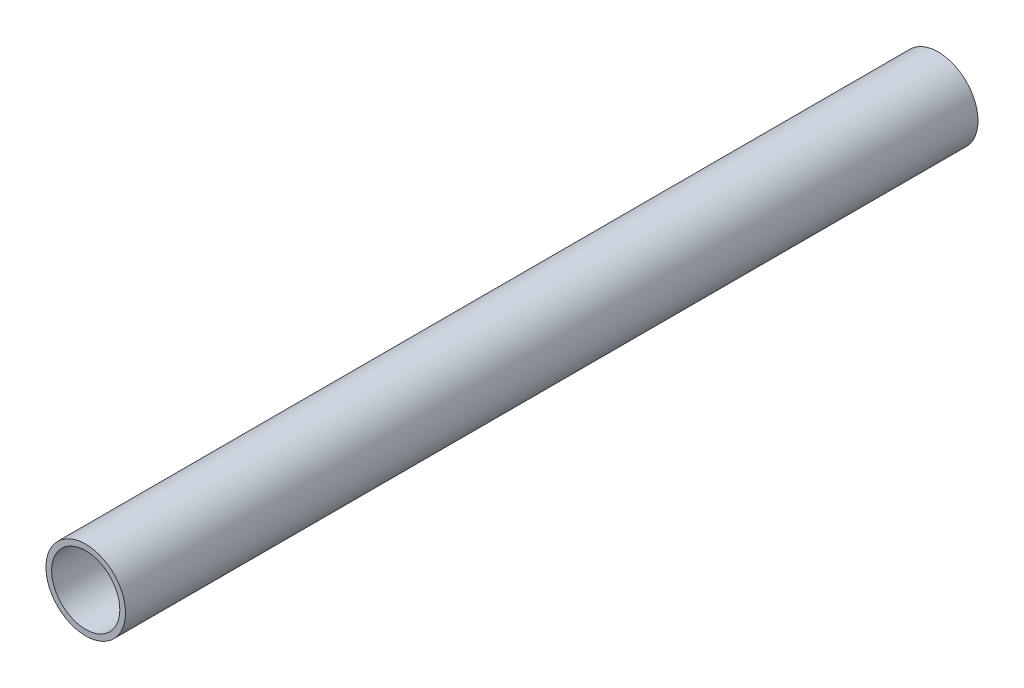
ISO-10303-21;
HEADER;
FILE_DESCRIPTION(('STEP AP214'),'2;1');
FILE_NAME('part.step','',(''),(''),'','','');
FILE_SCHEMA(('AUTOMOTIVE_DESIGN { 1 0 10303 214 1 1 1 1 }'));
ENDSEC;
DATA;
#1=APPLICATION_CONTEXT('core data for automotive mechanical design processes');
#2=APPLICATION_PROTOCOL_DEFINITION('international standard','automotive_design',2000,#1);
#3=PRODUCT_CONTEXT('',#1,'mechanical');
#4=PRODUCT('Part','Part','',(#3));
#5=PRODUCT_RELATED_PRODUCT_CATEGORY('part','',(#4));
#6=PRODUCT_DEFINITION_FORMATION('','',#4);
#7=PRODUCT_DEFINITION_CONTEXT('part definition',#1,'design');
#8=PRODUCT_DEFINITION('design','',#6,#7);
#9=PRODUCT_DEFINITION_SHAPE('','',#8);
#10=(LENGTH_UNIT() NAMED_UNIT(*) SI_UNIT(.MILLI.,.METRE.));
#11=(NAMED_UNIT(*) PLANE_ANGLE_UNIT() SI_UNIT($,.RADIAN.));
#12=(NAMED_UNIT(*) SI_UNIT($,.STERADIAN.) SOLID_ANGLE_UNIT());
#13=UNCERTAINTY_MEASURE_WITH_UNIT(LENGTH_MEASURE(1.E-05),#10,'distance_accuracy_value','');
#14=(GEOMETRIC_REPRESENTATION_CONTEXT(3) GLOBAL_UNCERTAINTY_ASSIGNED_CONTEXT((#13)) GLOBAL_UNIT_ASSIGNED_CONTEXT((#10,
#11,#12)) REPRESENTATION_CONTEXT('',''));
#15=CARTESIAN_POINT('',(0.,0.,0.));
#16=DIRECTION('',(0.,0.,1.));
#17=DIRECTION('',(1.,0.,0.));
#18=AXIS2_PLACEMENT_3D('',#15,#16,#17);
#19=CARTESIAN_POINT('',(0.,0.,150.));
#20=DIRECTION('',(0.,0.,1.));
#21=DIRECTION('',(1.,0.,0.));
#22=AXIS2_PLACEMENT_3D('',#19,#20,#21);
#23=PLANE('',#22);
#24=CARTESIAN_POINT('',(0.,0.,150.));
#25=DIRECTION('',(0.,0.,1.));
#26=DIRECTION('',(1.,0.,0.));
#27=AXIS2_PLACEMENT_3D('',#24,#25,#26);
#28=CIRCLE('',#27,7.);
#29=CARTESIAN_POINT('',(7.,0.,150.));
#30=VERTEX_POINT('',#29);
#31=EDGE_CURVE('E10',#30,#30,#28,.T.);
#32=ORIENTED_EDGE('',*,*,#31,.T.);
#33=EDGE_LOOP('',(#32));
#34=FACE_BOUND('',#33,.T.);
#35=CARTESIAN_POINT('',(0.,0.,150.));
#36=DIRECTION('',(0.,0.,1.));
#37=DIRECTION('',(1.,0.,0.));
#38=AXIS2_PLACEMENT_3D('',#35,#36,#37);
#39=CIRCLE('',#38,6.);
#40=CARTESIAN_POINT('',(6.,0.,150.));
#41=VERTEX_POINT('',#40);
#42=EDGE_CURVE('E44',#41,#41,#39,.T.);
#43=ORIENTED_EDGE('',*,*,#42,.F.);
#44=EDGE_LOOP('',(#43));
#45=FACE_BOUND('',#44,.T.);
#46=ADVANCED_FACE('F33',(#34,#45),#23,.T.);
#47=CARTESIAN_POINT('',(0.,0.,0.));
#48=DIRECTION('',(0.,0.,1.));
#49=DIRECTION('',(1.,0.,0.));
#50=AXIS2_PLACEMENT_3D('',#47,#48,#49);
#51=PLANE('',#50);
#52=CARTESIAN_POINT('',(0.,0.,0.));
#53=DIRECTION('',(0.,0.,1.));
#54=DIRECTION('',(1.,0.,0.));
#55=AXIS2_PLACEMENT_3D('',#52,#53,#54);
#56=CIRCLE('',#55,7.);
#57=CARTESIAN_POINT('',(7.,0.,0.));
#58=VERTEX_POINT('',#57);
#59=EDGE_CURVE('E37',#58,#58,#56,.T.);
#60=ORIENTED_EDGE('',*,*,#59,.F.);
#61=EDGE_LOOP('',(#60));
#62=FACE_BOUND('',#61,.T.);
#63=CARTESIAN_POINT('',(0.,0.,0.));
#64=DIRECTION('',(0.,0.,1.));
#65=DIRECTION('',(1.,0.,0.));
#66=AXIS2_PLACEMENT_3D('',#63,#64,#65);
#67=CIRCLE('',#66,6.);
#68=CARTESIAN_POINT('',(6.,0.,0.));
#69=VERTEX_POINT('',#68);
#70=EDGE_CURVE('E46',#69,#69,#67,.T.);
#71=ORIENTED_EDGE('',*,*,#70,.T.);
#72=EDGE_LOOP('',(#71));
#73=FACE_BOUND('',#72,.T.);
#74=ADVANCED_FACE('F56',(#62,#73),#51,.F.);
#75=CARTESIAN_POINT('',(0.,0.,150.));
#76=DIRECTION('',(0.,0.,-1.));
#77=DIRECTION('',(-1.,0.,0.));
#78=AXIS2_PLACEMENT_3D('',#75,#76,#77);
#79=CYLINDRICAL_SURFACE('',#78,7.);
#80=ORIENTED_EDGE('',*,*,#31,.F.);
#81=EDGE_LOOP('',(#80));
#82=FACE_BOUND('',#81,.T.);
#83=ORIENTED_EDGE('',*,*,#59,.T.);
#84=EDGE_LOOP('',(#83));
#85=FACE_BOUND('',#84,.T.);
#86=ADVANCED_FACE('F35',(#82,#85),#79,.T.);
#87=CARTESIAN_POINT('',(0.,0.,150.));
#88=DIRECTION('',(0.,0.,-1.));
#89=DIRECTION('',(-1.,0.,0.));
#90=AXIS2_PLACEMENT_3D('',#87,#88,#89);
#91=CYLINDRICAL_SURFACE('',#90,6.);
#92=ORIENTED_EDGE('',*,*,#42,.T.);
#93=EDGE_LOOP('',(#92));
#94=FACE_BOUND('',#93,.T.);
#95=ORIENTED_EDGE('',*,*,#70,.F.);
#96=EDGE_LOOP('',(#95));
#97=FACE_BOUND('',#96,.T.);
#98=ADVANCED_FACE('F52',(#94,#97),#91,.F.);
#99=CLOSED_SHELL('',(#46,#74,#86,#98));
#100=MANIFOLD_SOLID_BREP('B2',#99);
#101=ADVANCED_BREP_SHAPE_REPRESENTATION('',(#18,#100),#14);
#102=SHAPE_DEFINITION_REPRESENTATION(#9,#101);
ENDSEC;
END-ISO-10303-21;
